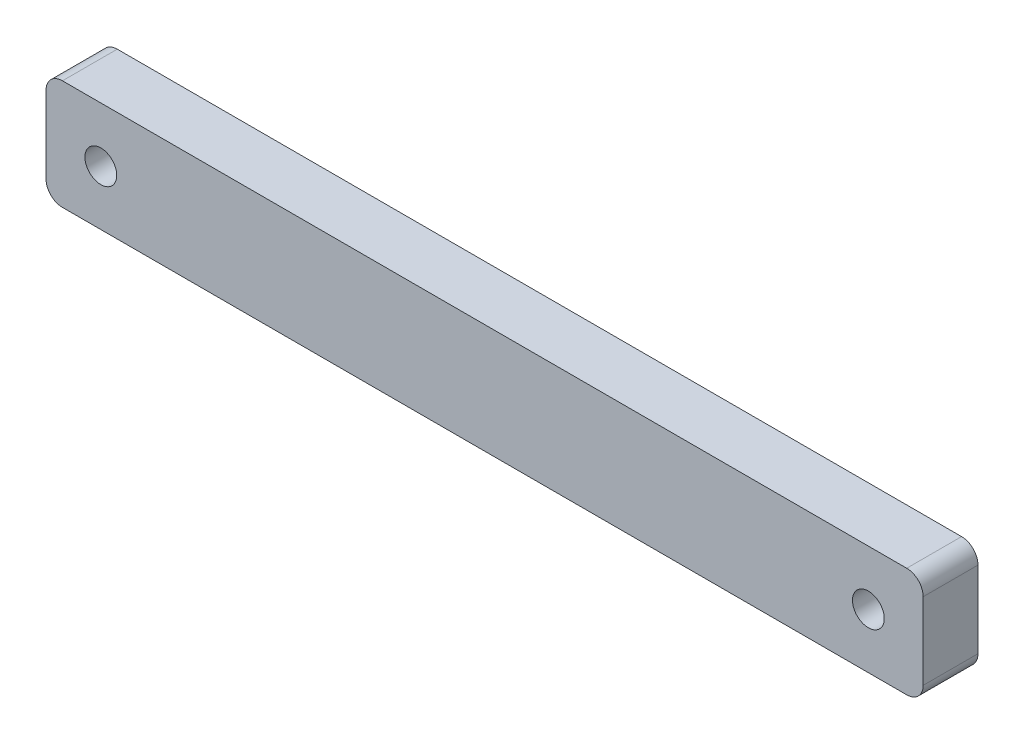
ISO-10303-21;
HEADER;
FILE_DESCRIPTION(('STEP AP214'),'2;1');
FILE_NAME('part.step','',(''),(''),'','','');
FILE_SCHEMA(('AUTOMOTIVE_DESIGN { 1 0 10303 214 1 1 1 1 }'));
ENDSEC;
DATA;
#1=APPLICATION_CONTEXT('core data for automotive mechanical design processes');
#2=APPLICATION_PROTOCOL_DEFINITION('international standard','automotive_design',2000,#1);
#3=PRODUCT_CONTEXT('',#1,'mechanical');
#4=PRODUCT('Part','Part','',(#3));
#5=PRODUCT_RELATED_PRODUCT_CATEGORY('part','',(#4));
#6=PRODUCT_DEFINITION_FORMATION('','',#4);
#7=PRODUCT_DEFINITION_CONTEXT('part definition',#1,'design');
#8=PRODUCT_DEFINITION('design','',#6,#7);
#9=PRODUCT_DEFINITION_SHAPE('','',#8);
#10=(LENGTH_UNIT() NAMED_UNIT(*) SI_UNIT(.MILLI.,.METRE.));
#11=(NAMED_UNIT(*) PLANE_ANGLE_UNIT() SI_UNIT($,.RADIAN.));
#12=(NAMED_UNIT(*) SI_UNIT($,.STERADIAN.) SOLID_ANGLE_UNIT());
#13=UNCERTAINTY_MEASURE_WITH_UNIT(LENGTH_MEASURE(1.E-05),#10,'distance_accuracy_value','');
#14=(GEOMETRIC_REPRESENTATION_CONTEXT(3) GLOBAL_UNCERTAINTY_ASSIGNED_CONTEXT((#13)) GLOBAL_UNIT_ASSIGNED_CONTEXT((#10,
#11,#12)) REPRESENTATION_CONTEXT('',''));
#15=CARTESIAN_POINT('',(0.,0.,0.));
#16=DIRECTION('',(0.,0.,1.));
#17=DIRECTION('',(1.,0.,0.));
#18=AXIS2_PLACEMENT_3D('',#15,#16,#17);
#19=CARTESIAN_POINT('',(-88.9,0.,12.7));
#20=DIRECTION('',(0.,0.,-1.));
#21=DIRECTION('',(-1.,0.,0.));
#22=AXIS2_PLACEMENT_3D('',#19,#20,#21);
#23=CYLINDRICAL_SURFACE('',#22,3.683);
#24=CARTESIAN_POINT('',(-88.9,0.,12.7));
#25=DIRECTION('',(0.,0.,1.));
#26=DIRECTION('',(1.,0.,0.));
#27=AXIS2_PLACEMENT_3D('',#24,#25,#26);
#28=CIRCLE('',#27,3.683);
#29=CARTESIAN_POINT('',(-85.217,0.,12.7));
#30=VERTEX_POINT('',#29);
#31=EDGE_CURVE('E138',#30,#30,#28,.T.);
#32=ORIENTED_EDGE('',*,*,#31,.T.);
#33=EDGE_LOOP('',(#32));
#34=FACE_BOUND('',#33,.T.);
#35=CARTESIAN_POINT('',(-88.9,0.,6.35));
#36=DIRECTION('',(0.,0.,-1.));
#37=DIRECTION('',(-1.,0.,0.));
#38=AXIS2_PLACEMENT_3D('',#35,#36,#37);
#39=CIRCLE('',#38,3.68300000000001);
#40=CARTESIAN_POINT('',(-92.583,0.,6.35));
#41=VERTEX_POINT('',#40);
#42=EDGE_CURVE('E190',#41,#41,#39,.T.);
#43=ORIENTED_EDGE('',*,*,#42,.T.);
#44=EDGE_LOOP('',(#43));
#45=FACE_BOUND('',#44,.T.);
#46=ADVANCED_FACE('F36',(#34,#45),#23,.F.);
#47=CARTESIAN_POINT('',(88.9,0.,12.7));
#48=DIRECTION('',(0.,0.,-1.));
#49=DIRECTION('',(-1.,0.,0.));
#50=AXIS2_PLACEMENT_3D('',#47,#48,#49);
#51=CYLINDRICAL_SURFACE('',#50,3.683);
#52=CARTESIAN_POINT('',(88.9,0.,12.7));
#53=DIRECTION('',(0.,0.,1.));
#54=DIRECTION('',(1.,0.,0.));
#55=AXIS2_PLACEMENT_3D('',#52,#53,#54);
#56=CIRCLE('',#55,3.683);
#57=CARTESIAN_POINT('',(92.583,0.,12.7));
#58=VERTEX_POINT('',#57);
#59=EDGE_CURVE('E184',#58,#58,#56,.T.);
#60=ORIENTED_EDGE('',*,*,#59,.T.);
#61=EDGE_LOOP('',(#60));
#62=FACE_BOUND('',#61,.T.);
#63=CARTESIAN_POINT('',(88.9,0.,6.35));
#64=DIRECTION('',(0.,0.,-1.));
#65=DIRECTION('',(-1.,0.,0.));
#66=AXIS2_PLACEMENT_3D('',#63,#64,#65);
#67=CIRCLE('',#66,3.683);
#68=CARTESIAN_POINT('',(85.217,0.,6.35));
#69=VERTEX_POINT('',#68);
#70=EDGE_CURVE('E187',#69,#69,#67,.T.);
#71=ORIENTED_EDGE('',*,*,#70,.T.);
#72=EDGE_LOOP('',(#71));
#73=FACE_BOUND('',#72,.T.);
#74=ADVANCED_FACE('F206',(#62,#73),#51,.F.);
#75=CARTESIAN_POINT('',(97.79,8.89000000000001,12.7));
#76=DIRECTION('',(0.,0.,1.));
#77=DIRECTION('',(1.,0.,0.));
#78=AXIS2_PLACEMENT_3D('',#75,#76,#77);
#79=PLANE('',#78);
#80=ORIENTED_EDGE('',*,*,#31,.F.);
#81=EDGE_LOOP('',(#80));
#82=FACE_BOUND('',#81,.T.);
#83=CARTESIAN_POINT('',(97.79,8.89000000000001,12.7));
#84=DIRECTION('',(0.,0.,1.));
#85=DIRECTION('',(1.,0.,0.));
#86=AXIS2_PLACEMENT_3D('',#83,#84,#85);
#87=CIRCLE('',#86,3.81);
#88=CARTESIAN_POINT('',(101.6,8.88999999999999,12.7));
#89=VERTEX_POINT('',#88);
#90=CARTESIAN_POINT('',(97.7899999999999,12.7,12.7));
#91=VERTEX_POINT('',#90);
#92=EDGE_CURVE('E149',#89,#91,#87,.T.);
#93=ORIENTED_EDGE('',*,*,#92,.T.);
#94=DIRECTION('',(-1.,0.,0.));
#95=VECTOR('',#94,1.);
#96=CARTESIAN_POINT('',(97.7899999999999,12.7,12.7));
#97=LINE('',#96,#95);
#98=CARTESIAN_POINT('',(-97.79,12.7,12.7));
#99=VERTEX_POINT('',#98);
#100=EDGE_CURVE('E96',#91,#99,#97,.T.);
#101=ORIENTED_EDGE('',*,*,#100,.T.);
#102=CARTESIAN_POINT('',(-97.79,8.88999999999999,12.7));
#103=DIRECTION('',(0.,0.,1.));
#104=DIRECTION('',(1.,0.,0.));
#105=AXIS2_PLACEMENT_3D('',#102,#103,#104);
#106=CIRCLE('',#105,3.81);
#107=CARTESIAN_POINT('',(-101.6,8.88999999999996,12.7));
#108=VERTEX_POINT('',#107);
#109=EDGE_CURVE('E164',#99,#108,#106,.T.);
#110=ORIENTED_EDGE('',*,*,#109,.T.);
#111=DIRECTION('',(0.,-1.,0.));
#112=VECTOR('',#111,1.);
#113=CARTESIAN_POINT('',(-101.6,-8.88999999999999,12.7));
#114=LINE('',#113,#112);
#115=CARTESIAN_POINT('',(-101.6,-8.89000000000001,12.7));
#116=VERTEX_POINT('',#115);
#117=EDGE_CURVE('E176',#108,#116,#114,.T.);
#118=ORIENTED_EDGE('',*,*,#117,.T.);
#119=CARTESIAN_POINT('',(-97.79,-8.89000000000001,12.7));
#120=DIRECTION('',(0.,0.,1.));
#121=DIRECTION('',(-1.,0.,0.));
#122=AXIS2_PLACEMENT_3D('',#119,#120,#121);
#123=CIRCLE('',#122,3.81);
#124=CARTESIAN_POINT('',(-97.79,-12.7,12.7));
#125=VERTEX_POINT('',#124);
#126=EDGE_CURVE('E116',#116,#125,#123,.T.);
#127=ORIENTED_EDGE('',*,*,#126,.T.);
#128=DIRECTION('',(1.,0.,0.));
#129=VECTOR('',#128,1.);
#130=CARTESIAN_POINT('',(97.7899999999999,-12.7,12.7));
#131=LINE('',#130,#129);
#132=CARTESIAN_POINT('',(97.7899999999999,-12.7,12.7));
#133=VERTEX_POINT('',#132);
#134=EDGE_CURVE('E109',#125,#133,#131,.T.);
#135=ORIENTED_EDGE('',*,*,#134,.T.);
#136=CARTESIAN_POINT('',(97.79,-8.88999999999999,12.7));
#137=DIRECTION('',(0.,0.,1.));
#138=DIRECTION('',(1.,0.,0.));
#139=AXIS2_PLACEMENT_3D('',#136,#137,#138);
#140=CIRCLE('',#139,3.81);
#141=CARTESIAN_POINT('',(101.6,-8.88999999999996,12.7));
#142=VERTEX_POINT('',#141);
#143=EDGE_CURVE('E114',#133,#142,#140,.T.);
#144=ORIENTED_EDGE('',*,*,#143,.T.);
#145=DIRECTION('',(0.,1.,0.));
#146=VECTOR('',#145,1.);
#147=CARTESIAN_POINT('',(101.6,-8.88999999999996,12.7));
#148=LINE('',#147,#146);
#149=EDGE_CURVE('E53',#142,#89,#148,.T.);
#150=ORIENTED_EDGE('',*,*,#149,.T.);
#151=EDGE_LOOP('',(#93,#101,#110,#118,#127,#135,#144,#150));
#152=FACE_BOUND('',#151,.T.);
#153=ORIENTED_EDGE('',*,*,#59,.F.);
#154=EDGE_LOOP('',(#153));
#155=FACE_BOUND('',#154,.T.);
#156=ADVANCED_FACE('F111',(#82,#152,#155),#79,.T.);
#157=CARTESIAN_POINT('',(97.79,8.89000000000001,0.));
#158=DIRECTION('',(0.,0.,1.));
#159=DIRECTION('',(1.,0.,0.));
#160=AXIS2_PLACEMENT_3D('',#157,#158,#159);
#161=PLANE('',#160);
#162=CARTESIAN_POINT('',(97.79,8.89000000000001,0.));
#163=DIRECTION('',(0.,0.,1.));
#164=DIRECTION('',(1.,0.,0.));
#165=AXIS2_PLACEMENT_3D('',#162,#163,#164);
#166=CIRCLE('',#165,3.81);
#167=CARTESIAN_POINT('',(101.6,8.88999999999999,0.));
#168=VERTEX_POINT('',#167);
#169=CARTESIAN_POINT('',(97.7899999999999,12.7,0.));
#170=VERTEX_POINT('',#169);
#171=EDGE_CURVE('E134',#168,#170,#166,.T.);
#172=ORIENTED_EDGE('',*,*,#171,.F.);
#173=DIRECTION('',(0.,1.,0.));
#174=VECTOR('',#173,1.);
#175=CARTESIAN_POINT('',(101.6,-8.88999999999996,0.));
#176=LINE('',#175,#174);
#177=CARTESIAN_POINT('',(101.6,-8.88999999999996,0.));
#178=VERTEX_POINT('',#177);
#179=EDGE_CURVE('E88',#178,#168,#176,.T.);
#180=ORIENTED_EDGE('',*,*,#179,.F.);
#181=CARTESIAN_POINT('',(97.79,-8.88999999999999,0.));
#182=DIRECTION('',(0.,0.,1.));
#183=DIRECTION('',(1.,0.,0.));
#184=AXIS2_PLACEMENT_3D('',#181,#182,#183);
#185=CIRCLE('',#184,3.81);
#186=CARTESIAN_POINT('',(97.7899999999999,-12.7,0.));
#187=VERTEX_POINT('',#186);
#188=EDGE_CURVE('E82',#187,#178,#185,.T.);
#189=ORIENTED_EDGE('',*,*,#188,.F.);
#190=DIRECTION('',(1.,0.,0.));
#191=VECTOR('',#190,1.);
#192=CARTESIAN_POINT('',(97.7899999999999,-12.7,0.));
#193=LINE('',#192,#191);
#194=CARTESIAN_POINT('',(-97.79,-12.7,0.));
#195=VERTEX_POINT('',#194);
#196=EDGE_CURVE('E124',#195,#187,#193,.T.);
#197=ORIENTED_EDGE('',*,*,#196,.F.);
#198=CARTESIAN_POINT('',(-97.79,-8.89000000000001,0.));
#199=DIRECTION('',(0.,0.,1.));
#200=DIRECTION('',(-1.,0.,0.));
#201=AXIS2_PLACEMENT_3D('',#198,#199,#200);
#202=CIRCLE('',#201,3.81);
#203=CARTESIAN_POINT('',(-101.6,-8.89000000000001,0.));
#204=VERTEX_POINT('',#203);
#205=EDGE_CURVE('E144',#204,#195,#202,.T.);
#206=ORIENTED_EDGE('',*,*,#205,.F.);
#207=DIRECTION('',(0.,-1.,0.));
#208=VECTOR('',#207,1.);
#209=CARTESIAN_POINT('',(-101.6,-8.88999999999999,0.));
#210=LINE('',#209,#208);
#211=CARTESIAN_POINT('',(-101.6,8.88999999999996,0.));
#212=VERTEX_POINT('',#211);
#213=EDGE_CURVE('E142',#212,#204,#210,.T.);
#214=ORIENTED_EDGE('',*,*,#213,.F.);
#215=CARTESIAN_POINT('',(-97.79,8.88999999999999,0.));
#216=DIRECTION('',(0.,0.,1.));
#217=DIRECTION('',(1.,0.,0.));
#218=AXIS2_PLACEMENT_3D('',#215,#216,#217);
#219=CIRCLE('',#218,3.81);
#220=CARTESIAN_POINT('',(-97.79,12.7,0.));
#221=VERTEX_POINT('',#220);
#222=EDGE_CURVE('E140',#221,#212,#219,.T.);
#223=ORIENTED_EDGE('',*,*,#222,.F.);
#224=DIRECTION('',(-1.,0.,0.));
#225=VECTOR('',#224,1.);
#226=CARTESIAN_POINT('',(97.7899999999999,12.7,0.));
#227=LINE('',#226,#225);
#228=EDGE_CURVE('E137',#170,#221,#227,.T.);
#229=ORIENTED_EDGE('',*,*,#228,.F.);
#230=EDGE_LOOP('',(#172,#180,#189,#197,#206,#214,#223,#229));
#231=FACE_BOUND('',#230,.T.);
#232=ADVANCED_FACE('F168',(#231),#161,.F.);
#233=CARTESIAN_POINT('',(97.79,8.89000000000001,12.7));
#234=DIRECTION('',(0.,0.,-1.));
#235=DIRECTION('',(-1.,0.,0.));
#236=AXIS2_PLACEMENT_3D('',#233,#234,#235);
#237=CYLINDRICAL_SURFACE('',#236,3.81);
#238=ORIENTED_EDGE('',*,*,#171,.T.);
#239=DIRECTION('',(0.,0.,-1.));
#240=VECTOR('',#239,1.);
#241=CARTESIAN_POINT('',(97.7899999999999,12.7,12.7));
#242=LINE('',#241,#240);
#243=EDGE_CURVE('E11',#91,#170,#242,.T.);
#244=ORIENTED_EDGE('',*,*,#243,.F.);
#245=ORIENTED_EDGE('',*,*,#92,.F.);
#246=DIRECTION('',(0.,0.,-1.));
#247=VECTOR('',#246,1.);
#248=CARTESIAN_POINT('',(101.6,8.88999999999999,12.7));
#249=LINE('',#248,#247);
#250=EDGE_CURVE('E130',#89,#168,#249,.T.);
#251=ORIENTED_EDGE('',*,*,#250,.T.);
#252=EDGE_LOOP('',(#238,#244,#245,#251));
#253=FACE_BOUND('',#252,.T.);
#254=ADVANCED_FACE('F38',(#253),#237,.T.);
#255=CARTESIAN_POINT('',(97.7899999999999,12.7,12.7));
#256=DIRECTION('',(0.,-1.,0.));
#257=DIRECTION('',(1.,0.,0.));
#258=AXIS2_PLACEMENT_3D('',#255,#256,#257);
#259=PLANE('',#258);
#260=ORIENTED_EDGE('',*,*,#228,.T.);
#261=DIRECTION('',(0.,0.,-1.));
#262=VECTOR('',#261,1.);
#263=CARTESIAN_POINT('',(-97.79,12.7,12.7));
#264=LINE('',#263,#262);
#265=EDGE_CURVE('E45',#99,#221,#264,.T.);
#266=ORIENTED_EDGE('',*,*,#265,.F.);
#267=ORIENTED_EDGE('',*,*,#100,.F.);
#268=ORIENTED_EDGE('',*,*,#243,.T.);
#269=EDGE_LOOP('',(#260,#266,#267,#268));
#270=FACE_BOUND('',#269,.T.);
#271=ADVANCED_FACE('F231',(#270),#259,.F.);
#272=CARTESIAN_POINT('',(-97.79,8.88999999999999,12.7));
#273=DIRECTION('',(0.,0.,-1.));
#274=DIRECTION('',(-1.,0.,0.));
#275=AXIS2_PLACEMENT_3D('',#272,#273,#274);
#276=CYLINDRICAL_SURFACE('',#275,3.81);
#277=ORIENTED_EDGE('',*,*,#222,.T.);
#278=DIRECTION('',(0.,0.,-1.));
#279=VECTOR('',#278,1.);
#280=CARTESIAN_POINT('',(-101.6,8.88999999999996,12.7));
#281=LINE('',#280,#279);
#282=EDGE_CURVE('E156',#108,#212,#281,.T.);
#283=ORIENTED_EDGE('',*,*,#282,.F.);
#284=ORIENTED_EDGE('',*,*,#109,.F.);
#285=ORIENTED_EDGE('',*,*,#265,.T.);
#286=EDGE_LOOP('',(#277,#283,#284,#285));
#287=FACE_BOUND('',#286,.T.);
#288=ADVANCED_FACE('F162',(#287),#276,.T.);
#289=CARTESIAN_POINT('',(-101.6,-8.88999999999999,12.7));
#290=DIRECTION('',(1.,0.,0.));
#291=DIRECTION('',(0.,0.,-1.));
#292=AXIS2_PLACEMENT_3D('',#289,#290,#291);
#293=PLANE('',#292);
#294=ORIENTED_EDGE('',*,*,#213,.T.);
#295=DIRECTION('',(0.,0.,-1.));
#296=VECTOR('',#295,1.);
#297=CARTESIAN_POINT('',(-101.6,-8.89000000000001,12.7));
#298=LINE('',#297,#296);
#299=EDGE_CURVE('E153',#116,#204,#298,.T.);
#300=ORIENTED_EDGE('',*,*,#299,.F.);
#301=ORIENTED_EDGE('',*,*,#117,.F.);
#302=ORIENTED_EDGE('',*,*,#282,.T.);
#303=EDGE_LOOP('',(#294,#300,#301,#302));
#304=FACE_BOUND('',#303,.T.);
#305=ADVANCED_FACE('F172',(#304),#293,.F.);
#306=CARTESIAN_POINT('',(-97.79,-8.89000000000001,12.7));
#307=DIRECTION('',(0.,0.,-1.));
#308=DIRECTION('',(-1.,0.,0.));
#309=AXIS2_PLACEMENT_3D('',#306,#307,#308);
#310=CYLINDRICAL_SURFACE('',#309,3.81);
#311=ORIENTED_EDGE('',*,*,#205,.T.);
#312=DIRECTION('',(0.,0.,-1.));
#313=VECTOR('',#312,1.);
#314=CARTESIAN_POINT('',(-97.79,-12.7,12.7));
#315=LINE('',#314,#313);
#316=EDGE_CURVE('E125',#125,#195,#315,.T.);
#317=ORIENTED_EDGE('',*,*,#316,.F.);
#318=ORIENTED_EDGE('',*,*,#126,.F.);
#319=ORIENTED_EDGE('',*,*,#299,.T.);
#320=EDGE_LOOP('',(#311,#317,#318,#319));
#321=FACE_BOUND('',#320,.T.);
#322=ADVANCED_FACE('F175',(#321),#310,.T.);
#323=CARTESIAN_POINT('',(97.7899999999999,-12.7,12.7));
#324=DIRECTION('',(0.,1.,0.));
#325=DIRECTION('',(-1.,0.,0.));
#326=AXIS2_PLACEMENT_3D('',#323,#324,#325);
#327=PLANE('',#326);
#328=ORIENTED_EDGE('',*,*,#196,.T.);
#329=DIRECTION('',(0.,0.,-1.));
#330=VECTOR('',#329,1.);
#331=CARTESIAN_POINT('',(97.7899999999999,-12.7,12.7));
#332=LINE('',#331,#330);
#333=EDGE_CURVE('E121',#133,#187,#332,.T.);
#334=ORIENTED_EDGE('',*,*,#333,.F.);
#335=ORIENTED_EDGE('',*,*,#134,.F.);
#336=ORIENTED_EDGE('',*,*,#316,.T.);
#337=EDGE_LOOP('',(#328,#334,#335,#336));
#338=FACE_BOUND('',#337,.T.);
#339=ADVANCED_FACE('F122',(#338),#327,.F.);
#340=CARTESIAN_POINT('',(97.79,-8.88999999999999,12.7));
#341=DIRECTION('',(0.,0.,-1.));
#342=DIRECTION('',(-1.,0.,0.));
#343=AXIS2_PLACEMENT_3D('',#340,#341,#342);
#344=CYLINDRICAL_SURFACE('',#343,3.81);
#345=ORIENTED_EDGE('',*,*,#188,.T.);
#346=DIRECTION('',(0.,0.,-1.));
#347=VECTOR('',#346,1.);
#348=CARTESIAN_POINT('',(101.6,-8.88999999999996,12.7));
#349=LINE('',#348,#347);
#350=EDGE_CURVE('E126',#142,#178,#349,.T.);
#351=ORIENTED_EDGE('',*,*,#350,.F.);
#352=ORIENTED_EDGE('',*,*,#143,.F.);
#353=ORIENTED_EDGE('',*,*,#333,.T.);
#354=EDGE_LOOP('',(#345,#351,#352,#353));
#355=FACE_BOUND('',#354,.T.);
#356=ADVANCED_FACE('F128',(#355),#344,.T.);
#357=CARTESIAN_POINT('',(101.6,-8.88999999999996,12.7));
#358=DIRECTION('',(-1.,0.,0.));
#359=DIRECTION('',(0.,0.,1.));
#360=AXIS2_PLACEMENT_3D('',#357,#358,#359);
#361=PLANE('',#360);
#362=ORIENTED_EDGE('',*,*,#179,.T.);
#363=ORIENTED_EDGE('',*,*,#250,.F.);
#364=ORIENTED_EDGE('',*,*,#149,.F.);
#365=ORIENTED_EDGE('',*,*,#350,.T.);
#366=EDGE_LOOP('',(#362,#363,#364,#365));
#367=FACE_BOUND('',#366,.T.);
#368=ADVANCED_FACE('F202',(#367),#361,.F.);
#369=CARTESIAN_POINT('',(88.9,0.,6.35));
#370=DIRECTION('',(0.,0.,-1.));
#371=DIRECTION('',(-1.,0.,0.));
#372=AXIS2_PLACEMENT_3D('',#369,#370,#371);
#373=PLANE('',#372);
#374=ORIENTED_EDGE('',*,*,#70,.F.);
#375=EDGE_LOOP('',(#374));
#376=FACE_BOUND('',#375,.T.);
#377=ADVANCED_FACE('F197',(#376),#373,.F.);
#378=CARTESIAN_POINT('',(-88.9,0.,6.35));
#379=DIRECTION('',(0.,0.,-1.));
#380=DIRECTION('',(-1.,0.,0.));
#381=AXIS2_PLACEMENT_3D('',#378,#379,#380);
#382=PLANE('',#381);
#383=ORIENTED_EDGE('',*,*,#42,.F.);
#384=EDGE_LOOP('',(#383));
#385=FACE_BOUND('',#384,.T.);
#386=ADVANCED_FACE('F195',(#385),#382,.F.);
#387=CLOSED_SHELL('',(#46,#74,#156,#232,#254,#271,#288,#305,#322,#339,#356,#368,#377,#386));
#388=MANIFOLD_SOLID_BREP('B2',#387);
#389=ADVANCED_BREP_SHAPE_REPRESENTATION('',(#18,#388),#14);
#390=SHAPE_DEFINITION_REPRESENTATION(#9,#389);
ENDSEC;
END-ISO-10303-21;
